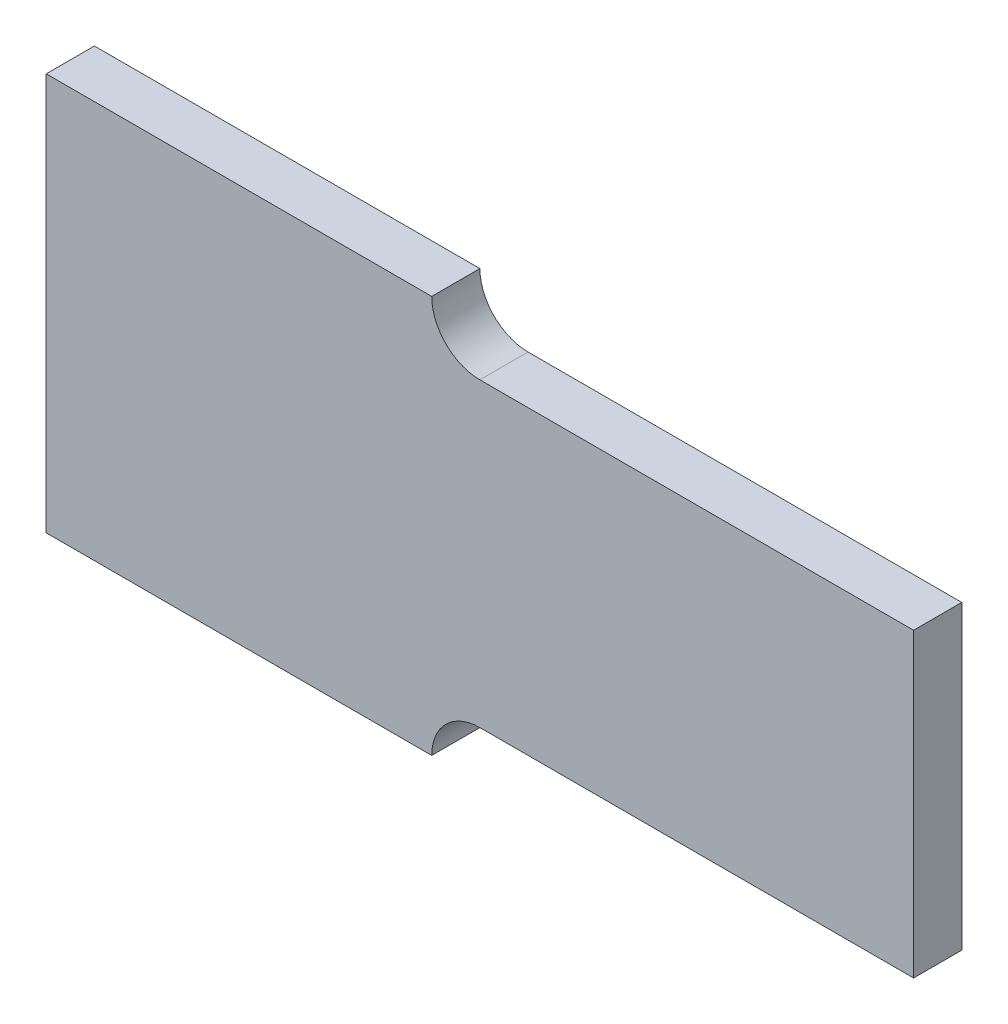
ISO-10303-21;
HEADER;
FILE_DESCRIPTION(('STEP AP214'),'2;1');
FILE_NAME('part.step','',(''),(''),'','','');
FILE_SCHEMA(('AUTOMOTIVE_DESIGN { 1 0 10303 214 1 1 1 1 }'));
ENDSEC;
DATA;
#1=APPLICATION_CONTEXT('core data for automotive mechanical design processes');
#2=APPLICATION_PROTOCOL_DEFINITION('international standard','automotive_design',2000,#1);
#3=PRODUCT_CONTEXT('',#1,'mechanical');
#4=PRODUCT('Part','Part','',(#3));
#5=PRODUCT_RELATED_PRODUCT_CATEGORY('part','',(#4));
#6=PRODUCT_DEFINITION_FORMATION('','',#4);
#7=PRODUCT_DEFINITION_CONTEXT('part definition',#1,'design');
#8=PRODUCT_DEFINITION('design','',#6,#7);
#9=PRODUCT_DEFINITION_SHAPE('','',#8);
#10=(LENGTH_UNIT() NAMED_UNIT(*) SI_UNIT(.MILLI.,.METRE.));
#11=(NAMED_UNIT(*) PLANE_ANGLE_UNIT() SI_UNIT($,.RADIAN.));
#12=(NAMED_UNIT(*) SI_UNIT($,.STERADIAN.) SOLID_ANGLE_UNIT());
#13=UNCERTAINTY_MEASURE_WITH_UNIT(LENGTH_MEASURE(1.E-05),#10,'distance_accuracy_value','');
#14=(GEOMETRIC_REPRESENTATION_CONTEXT(3) GLOBAL_UNCERTAINTY_ASSIGNED_CONTEXT((#13)) GLOBAL_UNIT_ASSIGNED_CONTEXT((#10,
#11,#12)) REPRESENTATION_CONTEXT('',''));
#15=CARTESIAN_POINT('',(0.,0.,0.));
#16=DIRECTION('',(0.,0.,1.));
#17=DIRECTION('',(1.,0.,0.));
#18=AXIS2_PLACEMENT_3D('',#15,#16,#17);
#19=CARTESIAN_POINT('',(114.3,104.775,12.7));
#20=DIRECTION('',(0.,0.,-1.));
#21=DIRECTION('',(-1.,0.,0.));
#22=AXIS2_PLACEMENT_3D('',#19,#20,#21);
#23=CYLINDRICAL_SURFACE('',#22,12.7);
#24=CARTESIAN_POINT('',(114.3,104.775,0.));
#25=DIRECTION('',(0.,0.,-1.));
#26=DIRECTION('',(1.,0.,0.));
#27=AXIS2_PLACEMENT_3D('',#24,#25,#26);
#28=CIRCLE('',#27,12.7);
#29=CARTESIAN_POINT('',(114.3,92.075,0.));
#30=VERTEX_POINT('',#29);
#31=CARTESIAN_POINT('',(101.6,104.775,0.));
#32=VERTEX_POINT('',#31);
#33=EDGE_CURVE('E127',#30,#32,#28,.T.);
#34=ORIENTED_EDGE('',*,*,#33,.T.);
#35=DIRECTION('',(0.,0.,-1.));
#36=VECTOR('',#35,1.);
#37=CARTESIAN_POINT('',(101.6,104.775,12.7));
#38=LINE('',#37,#36);
#39=CARTESIAN_POINT('',(101.6,104.775,12.7));
#40=VERTEX_POINT('',#39);
#41=EDGE_CURVE('E11',#40,#32,#38,.T.);
#42=ORIENTED_EDGE('',*,*,#41,.F.);
#43=CARTESIAN_POINT('',(114.3,104.775,12.7));
#44=DIRECTION('',(0.,0.,-1.));
#45=DIRECTION('',(1.,0.,0.));
#46=AXIS2_PLACEMENT_3D('',#43,#44,#45);
#47=CIRCLE('',#46,12.7);
#48=CARTESIAN_POINT('',(114.3,92.075,12.7));
#49=VERTEX_POINT('',#48);
#50=EDGE_CURVE('E141',#49,#40,#47,.T.);
#51=ORIENTED_EDGE('',*,*,#50,.F.);
#52=DIRECTION('',(0.,0.,-1.));
#53=VECTOR('',#52,1.);
#54=CARTESIAN_POINT('',(114.3,92.075,12.7));
#55=LINE('',#54,#53);
#56=EDGE_CURVE('E123',#49,#30,#55,.T.);
#57=ORIENTED_EDGE('',*,*,#56,.T.);
#58=EDGE_LOOP('',(#34,#42,#51,#57));
#59=FACE_BOUND('',#58,.T.);
#60=ADVANCED_FACE('F31',(#59),#23,.F.);
#61=CARTESIAN_POINT('',(101.6,104.775,12.7));
#62=DIRECTION('',(0.,-1.,0.));
#63=DIRECTION('',(0.,0.,-1.));
#64=AXIS2_PLACEMENT_3D('',#61,#62,#63);
#65=PLANE('',#64);
#66=DIRECTION('',(-1.,0.,0.));
#67=VECTOR('',#66,1.);
#68=CARTESIAN_POINT('',(101.6,104.775,0.));
#69=LINE('',#68,#67);
#70=CARTESIAN_POINT('',(0.,104.775,0.));
#71=VERTEX_POINT('',#70);
#72=EDGE_CURVE('E130',#32,#71,#69,.T.);
#73=ORIENTED_EDGE('',*,*,#72,.T.);
#74=DIRECTION('',(0.,0.,-1.));
#75=VECTOR('',#74,1.);
#76=CARTESIAN_POINT('',(0.,104.775,12.7));
#77=LINE('',#76,#75);
#78=CARTESIAN_POINT('',(0.,104.775,12.7));
#79=VERTEX_POINT('',#78);
#80=EDGE_CURVE('E39',#79,#71,#77,.T.);
#81=ORIENTED_EDGE('',*,*,#80,.F.);
#82=DIRECTION('',(-1.,0.,0.));
#83=VECTOR('',#82,1.);
#84=CARTESIAN_POINT('',(101.6,104.775,12.7));
#85=LINE('',#84,#83);
#86=EDGE_CURVE('E90',#40,#79,#85,.T.);
#87=ORIENTED_EDGE('',*,*,#86,.F.);
#88=ORIENTED_EDGE('',*,*,#41,.T.);
#89=EDGE_LOOP('',(#73,#81,#87,#88));
#90=FACE_BOUND('',#89,.T.);
#91=ADVANCED_FACE('F176',(#90),#65,.F.);
#92=CARTESIAN_POINT('',(0.,104.775,12.7));
#93=DIRECTION('',(1.,0.,0.));
#94=DIRECTION('',(0.,1.,0.));
#95=AXIS2_PLACEMENT_3D('',#92,#93,#94);
#96=PLANE('',#95);
#97=DIRECTION('',(0.,-1.,0.));
#98=VECTOR('',#97,1.);
#99=CARTESIAN_POINT('',(0.,104.775,0.));
#100=LINE('',#99,#98);
#101=CARTESIAN_POINT('',(0.,0.,0.));
#102=VERTEX_POINT('',#101);
#103=EDGE_CURVE('E132',#71,#102,#100,.T.);
#104=ORIENTED_EDGE('',*,*,#103,.T.);
#105=DIRECTION('',(0.,0.,-1.));
#106=VECTOR('',#105,1.);
#107=CARTESIAN_POINT('',(0.,0.,12.7));
#108=LINE('',#107,#106);
#109=CARTESIAN_POINT('',(0.,0.,12.7));
#110=VERTEX_POINT('',#109);
#111=EDGE_CURVE('E148',#110,#102,#108,.T.);
#112=ORIENTED_EDGE('',*,*,#111,.F.);
#113=DIRECTION('',(0.,-1.,0.));
#114=VECTOR('',#113,1.);
#115=CARTESIAN_POINT('',(0.,104.775,12.7));
#116=LINE('',#115,#114);
#117=EDGE_CURVE('E156',#79,#110,#116,.T.);
#118=ORIENTED_EDGE('',*,*,#117,.F.);
#119=ORIENTED_EDGE('',*,*,#80,.T.);
#120=EDGE_LOOP('',(#104,#112,#118,#119));
#121=FACE_BOUND('',#120,.T.);
#122=ADVANCED_FACE('F154',(#121),#96,.F.);
#123=CARTESIAN_POINT('',(0.,0.,12.7));
#124=DIRECTION('',(0.,1.,0.));
#125=DIRECTION('',(0.,0.,1.));
#126=AXIS2_PLACEMENT_3D('',#123,#124,#125);
#127=PLANE('',#126);
#128=DIRECTION('',(1.,0.,0.));
#129=VECTOR('',#128,1.);
#130=CARTESIAN_POINT('',(0.,0.,0.));
#131=LINE('',#130,#129);
#132=CARTESIAN_POINT('',(101.6,0.,0.));
#133=VERTEX_POINT('',#132);
#134=EDGE_CURVE('E134',#102,#133,#131,.T.);
#135=ORIENTED_EDGE('',*,*,#134,.T.);
#136=DIRECTION('',(0.,0.,-1.));
#137=VECTOR('',#136,1.);
#138=CARTESIAN_POINT('',(101.6,0.,12.7));
#139=LINE('',#138,#137);
#140=CARTESIAN_POINT('',(101.6,0.,12.7));
#141=VERTEX_POINT('',#140);
#142=EDGE_CURVE('E145',#141,#133,#139,.T.);
#143=ORIENTED_EDGE('',*,*,#142,.F.);
#144=DIRECTION('',(1.,0.,0.));
#145=VECTOR('',#144,1.);
#146=CARTESIAN_POINT('',(0.,0.,12.7));
#147=LINE('',#146,#145);
#148=EDGE_CURVE('E168',#110,#141,#147,.T.);
#149=ORIENTED_EDGE('',*,*,#148,.F.);
#150=ORIENTED_EDGE('',*,*,#111,.T.);
#151=EDGE_LOOP('',(#135,#143,#149,#150));
#152=FACE_BOUND('',#151,.T.);
#153=ADVANCED_FACE('F164',(#152),#127,.F.);
#154=CARTESIAN_POINT('',(114.3,0.,12.7));
#155=DIRECTION('',(0.,0.,-1.));
#156=DIRECTION('',(-1.,0.,0.));
#157=AXIS2_PLACEMENT_3D('',#154,#155,#156);
#158=CYLINDRICAL_SURFACE('',#157,12.7);
#159=CARTESIAN_POINT('',(114.3,0.,0.));
#160=DIRECTION('',(0.,0.,-1.));
#161=DIRECTION('',(1.,0.,0.));
#162=AXIS2_PLACEMENT_3D('',#159,#160,#161);
#163=CIRCLE('',#162,12.7);
#164=CARTESIAN_POINT('',(114.3,12.7,0.));
#165=VERTEX_POINT('',#164);
#166=EDGE_CURVE('E136',#133,#165,#163,.T.);
#167=ORIENTED_EDGE('',*,*,#166,.T.);
#168=DIRECTION('',(0.,0.,-1.));
#169=VECTOR('',#168,1.);
#170=CARTESIAN_POINT('',(114.3,12.7,12.7));
#171=LINE('',#170,#169);
#172=CARTESIAN_POINT('',(114.3,12.7,12.7));
#173=VERTEX_POINT('',#172);
#174=EDGE_CURVE('E118',#173,#165,#171,.T.);
#175=ORIENTED_EDGE('',*,*,#174,.F.);
#176=CARTESIAN_POINT('',(114.3,0.,12.7));
#177=DIRECTION('',(0.,0.,-1.));
#178=DIRECTION('',(1.,0.,0.));
#179=AXIS2_PLACEMENT_3D('',#176,#177,#178);
#180=CIRCLE('',#179,12.7);
#181=EDGE_CURVE('E109',#141,#173,#180,.T.);
#182=ORIENTED_EDGE('',*,*,#181,.F.);
#183=ORIENTED_EDGE('',*,*,#142,.T.);
#184=EDGE_LOOP('',(#167,#175,#182,#183));
#185=FACE_BOUND('',#184,.T.);
#186=ADVANCED_FACE('F167',(#185),#158,.F.);
#187=CARTESIAN_POINT('',(114.3,12.7,12.7));
#188=DIRECTION('',(0.,1.,0.));
#189=DIRECTION('',(0.,0.,1.));
#190=AXIS2_PLACEMENT_3D('',#187,#188,#189);
#191=PLANE('',#190);
#192=DIRECTION('',(1.,0.,0.));
#193=VECTOR('',#192,1.);
#194=CARTESIAN_POINT('',(114.3,12.7,0.));
#195=LINE('',#194,#193);
#196=CARTESIAN_POINT('',(228.6,12.7,0.));
#197=VERTEX_POINT('',#196);
#198=EDGE_CURVE('E117',#165,#197,#195,.T.);
#199=ORIENTED_EDGE('',*,*,#198,.T.);
#200=DIRECTION('',(0.,0.,-1.));
#201=VECTOR('',#200,1.);
#202=CARTESIAN_POINT('',(228.6,12.7,12.7));
#203=LINE('',#202,#201);
#204=CARTESIAN_POINT('',(228.6,12.7,12.7));
#205=VERTEX_POINT('',#204);
#206=EDGE_CURVE('E114',#205,#197,#203,.T.);
#207=ORIENTED_EDGE('',*,*,#206,.F.);
#208=DIRECTION('',(1.,0.,0.));
#209=VECTOR('',#208,1.);
#210=CARTESIAN_POINT('',(114.3,12.7,12.7));
#211=LINE('',#210,#209);
#212=EDGE_CURVE('E103',#173,#205,#211,.T.);
#213=ORIENTED_EDGE('',*,*,#212,.F.);
#214=ORIENTED_EDGE('',*,*,#174,.T.);
#215=EDGE_LOOP('',(#199,#207,#213,#214));
#216=FACE_BOUND('',#215,.T.);
#217=ADVANCED_FACE('F115',(#216),#191,.F.);
#218=CARTESIAN_POINT('',(228.6,12.7,12.7));
#219=DIRECTION('',(-1.,0.,0.));
#220=DIRECTION('',(0.,0.,1.));
#221=AXIS2_PLACEMENT_3D('',#218,#219,#220);
#222=PLANE('',#221);
#223=DIRECTION('',(0.,1.,0.));
#224=VECTOR('',#223,1.);
#225=CARTESIAN_POINT('',(228.6,12.7,0.));
#226=LINE('',#225,#224);
#227=CARTESIAN_POINT('',(228.6,92.075,0.));
#228=VERTEX_POINT('',#227);
#229=EDGE_CURVE('E76',#197,#228,#226,.T.);
#230=ORIENTED_EDGE('',*,*,#229,.T.);
#231=DIRECTION('',(0.,0.,-1.));
#232=VECTOR('',#231,1.);
#233=CARTESIAN_POINT('',(228.6,92.075,12.7));
#234=LINE('',#233,#232);
#235=CARTESIAN_POINT('',(228.6,92.075,12.7));
#236=VERTEX_POINT('',#235);
#237=EDGE_CURVE('E119',#236,#228,#234,.T.);
#238=ORIENTED_EDGE('',*,*,#237,.F.);
#239=DIRECTION('',(0.,1.,0.));
#240=VECTOR('',#239,1.);
#241=CARTESIAN_POINT('',(228.6,12.7,12.7));
#242=LINE('',#241,#240);
#243=EDGE_CURVE('E107',#205,#236,#242,.T.);
#244=ORIENTED_EDGE('',*,*,#243,.F.);
#245=ORIENTED_EDGE('',*,*,#206,.T.);
#246=EDGE_LOOP('',(#230,#238,#244,#245));
#247=FACE_BOUND('',#246,.T.);
#248=ADVANCED_FACE('F121',(#247),#222,.F.);
#249=CARTESIAN_POINT('',(228.6,92.075,12.7));
#250=DIRECTION('',(0.,-1.,0.));
#251=DIRECTION('',(1.,0.,0.));
#252=AXIS2_PLACEMENT_3D('',#249,#250,#251);
#253=PLANE('',#252);
#254=DIRECTION('',(-1.,0.,0.));
#255=VECTOR('',#254,1.);
#256=CARTESIAN_POINT('',(228.6,92.075,0.));
#257=LINE('',#256,#255);
#258=EDGE_CURVE('E82',#228,#30,#257,.T.);
#259=ORIENTED_EDGE('',*,*,#258,.T.);
#260=ORIENTED_EDGE('',*,*,#56,.F.);
#261=DIRECTION('',(-1.,0.,0.));
#262=VECTOR('',#261,1.);
#263=CARTESIAN_POINT('',(228.6,92.075,12.7));
#264=LINE('',#263,#262);
#265=EDGE_CURVE('E47',#236,#49,#264,.T.);
#266=ORIENTED_EDGE('',*,*,#265,.F.);
#267=ORIENTED_EDGE('',*,*,#237,.T.);
#268=EDGE_LOOP('',(#259,#260,#266,#267));
#269=FACE_BOUND('',#268,.T.);
#270=ADVANCED_FACE('F192',(#269),#253,.F.);
#271=CARTESIAN_POINT('',(114.3,104.775,12.7));
#272=DIRECTION('',(0.,0.,1.));
#273=DIRECTION('',(1.,0.,0.));
#274=AXIS2_PLACEMENT_3D('',#271,#272,#273);
#275=PLANE('',#274);
#276=ORIENTED_EDGE('',*,*,#50,.T.);
#277=ORIENTED_EDGE('',*,*,#86,.T.);
#278=ORIENTED_EDGE('',*,*,#117,.T.);
#279=ORIENTED_EDGE('',*,*,#148,.T.);
#280=ORIENTED_EDGE('',*,*,#181,.T.);
#281=ORIENTED_EDGE('',*,*,#212,.T.);
#282=ORIENTED_EDGE('',*,*,#243,.T.);
#283=ORIENTED_EDGE('',*,*,#265,.T.);
#284=EDGE_LOOP('',(#276,#277,#278,#279,#280,#281,#282,#283));
#285=FACE_BOUND('',#284,.T.);
#286=ADVANCED_FACE('F105',(#285),#275,.T.);
#287=CARTESIAN_POINT('',(114.3,104.775,0.));
#288=DIRECTION('',(0.,0.,1.));
#289=DIRECTION('',(1.,0.,0.));
#290=AXIS2_PLACEMENT_3D('',#287,#288,#289);
#291=PLANE('',#290);
#292=ORIENTED_EDGE('',*,*,#33,.F.);
#293=ORIENTED_EDGE('',*,*,#258,.F.);
#294=ORIENTED_EDGE('',*,*,#229,.F.);
#295=ORIENTED_EDGE('',*,*,#198,.F.);
#296=ORIENTED_EDGE('',*,*,#166,.F.);
#297=ORIENTED_EDGE('',*,*,#134,.F.);
#298=ORIENTED_EDGE('',*,*,#103,.F.);
#299=ORIENTED_EDGE('',*,*,#72,.F.);
#300=EDGE_LOOP('',(#292,#293,#294,#295,#296,#297,#298,#299));
#301=FACE_BOUND('',#300,.T.);
#302=ADVANCED_FACE('F160',(#301),#291,.F.);
#303=CLOSED_SHELL('',(#60,#91,#122,#153,#186,#217,#248,#270,#286,#302));
#304=MANIFOLD_SOLID_BREP('B2',#303);
#305=ADVANCED_BREP_SHAPE_REPRESENTATION('',(#18,#304),#14);
#306=SHAPE_DEFINITION_REPRESENTATION(#9,#305);
ENDSEC;
END-ISO-10303-21;
